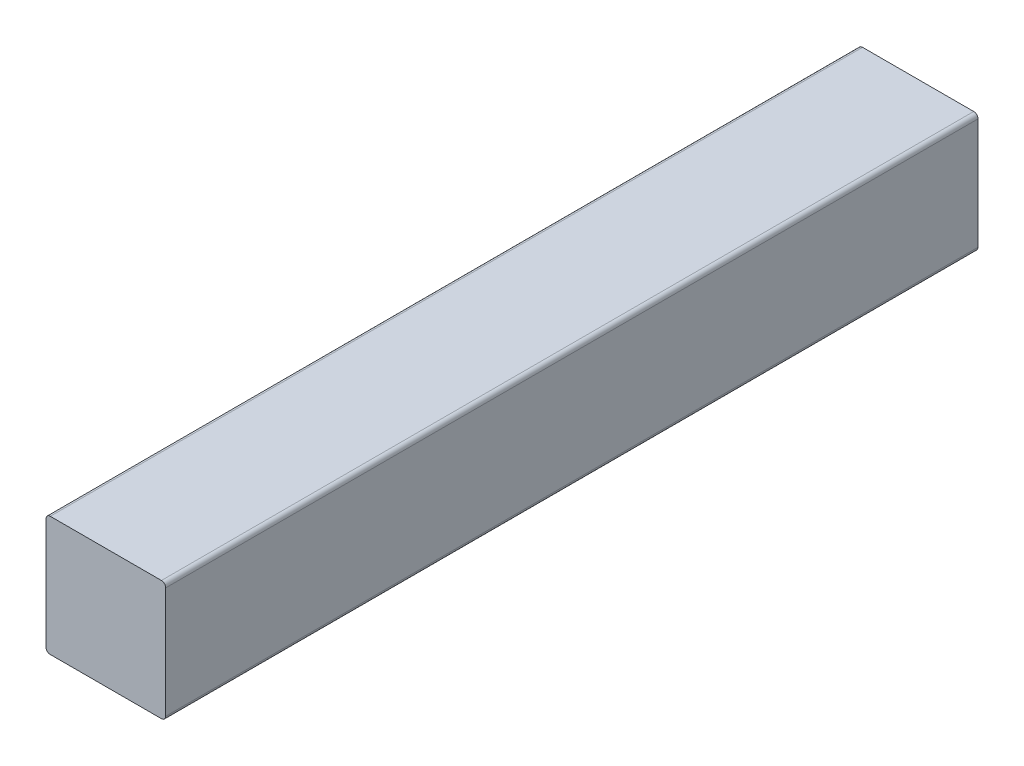
ISO-10303-21;
HEADER;
FILE_DESCRIPTION(('STEP AP214'),'2;1');
FILE_NAME('part.step','',(''),(''),'','','');
FILE_SCHEMA(('AUTOMOTIVE_DESIGN { 1 0 10303 214 1 1 1 1 }'));
ENDSEC;
DATA;
#1=APPLICATION_CONTEXT('core data for automotive mechanical design processes');
#2=APPLICATION_PROTOCOL_DEFINITION('international standard','automotive_design',2000,#1);
#3=PRODUCT_CONTEXT('',#1,'mechanical');
#4=PRODUCT('Part','Part','',(#3));
#5=PRODUCT_RELATED_PRODUCT_CATEGORY('part','',(#4));
#6=PRODUCT_DEFINITION_FORMATION('','',#4);
#7=PRODUCT_DEFINITION_CONTEXT('part definition',#1,'design');
#8=PRODUCT_DEFINITION('design','',#6,#7);
#9=PRODUCT_DEFINITION_SHAPE('','',#8);
#10=(LENGTH_UNIT() NAMED_UNIT(*) SI_UNIT(.MILLI.,.METRE.));
#11=(NAMED_UNIT(*) PLANE_ANGLE_UNIT() SI_UNIT($,.RADIAN.));
#12=(NAMED_UNIT(*) SI_UNIT($,.STERADIAN.) SOLID_ANGLE_UNIT());
#13=UNCERTAINTY_MEASURE_WITH_UNIT(LENGTH_MEASURE(1.E-05),#10,'distance_accuracy_value','');
#14=(GEOMETRIC_REPRESENTATION_CONTEXT(3) GLOBAL_UNCERTAINTY_ASSIGNED_CONTEXT((#13)) GLOBAL_UNIT_ASSIGNED_CONTEXT((#10,
#11,#12)) REPRESENTATION_CONTEXT('',''));
#15=CARTESIAN_POINT('',(0.,0.,0.));
#16=DIRECTION('',(0.,0.,1.));
#17=DIRECTION('',(1.,0.,0.));
#18=AXIS2_PLACEMENT_3D('',#15,#16,#17);
#19=CARTESIAN_POINT('',(44.45,88.9,-301.625));
#20=DIRECTION('',(-1.,0.,0.));
#21=DIRECTION('',(0.,0.,1.));
#22=AXIS2_PLACEMENT_3D('',#19,#20,#21);
#23=PLANE('',#22);
#24=DIRECTION('',(0.,-1.,0.));
#25=VECTOR('',#24,1.);
#26=CARTESIAN_POINT('',(44.45,88.9,301.625));
#27=LINE('',#26,#25);
#28=CARTESIAN_POINT('',(44.45,85.725,301.625));
#29=VERTEX_POINT('',#28);
#30=CARTESIAN_POINT('',(44.45,3.175,301.625));
#31=VERTEX_POINT('',#30);
#32=EDGE_CURVE('E121',#29,#31,#27,.T.);
#33=ORIENTED_EDGE('',*,*,#32,.T.);
#34=DIRECTION('',(0.,0.,-1.));
#35=VECTOR('',#34,1.);
#36=CARTESIAN_POINT('',(44.45,3.175,-301.625));
#37=LINE('',#36,#35);
#38=CARTESIAN_POINT('',(44.45,3.175,-301.625));
#39=VERTEX_POINT('',#38);
#40=EDGE_CURVE('E11',#31,#39,#37,.T.);
#41=ORIENTED_EDGE('',*,*,#40,.T.);
#42=DIRECTION('',(0.,-1.,0.));
#43=VECTOR('',#42,1.);
#44=CARTESIAN_POINT('',(44.45,88.9,-301.625));
#45=LINE('',#44,#43);
#46=CARTESIAN_POINT('',(44.45,85.725,-301.625));
#47=VERTEX_POINT('',#46);
#48=EDGE_CURVE('E126',#47,#39,#45,.T.);
#49=ORIENTED_EDGE('',*,*,#48,.F.);
#50=DIRECTION('',(0.,0.,-1.));
#51=VECTOR('',#50,1.);
#52=CARTESIAN_POINT('',(44.45,85.725,301.625));
#53=LINE('',#52,#51);
#54=EDGE_CURVE('E41',#47,#29,#53,.F.);
#55=ORIENTED_EDGE('',*,*,#54,.T.);
#56=EDGE_LOOP('',(#33,#41,#49,#55));
#57=FACE_BOUND('',#56,.T.);
#58=ADVANCED_FACE('F33',(#57),#23,.F.);
#59=CARTESIAN_POINT('',(-44.45,88.9,-301.625));
#60=DIRECTION('',(0.,0.,1.));
#61=DIRECTION('',(1.,0.,0.));
#62=AXIS2_PLACEMENT_3D('',#59,#60,#61);
#63=PLANE('',#62);
#64=DIRECTION('',(-1.,0.,0.));
#65=VECTOR('',#64,1.);
#66=CARTESIAN_POINT('',(-44.45,0.,-301.625));
#67=LINE('',#66,#65);
#68=CARTESIAN_POINT('',(41.275,0.,-301.625));
#69=VERTEX_POINT('',#68);
#70=CARTESIAN_POINT('',(-41.275,0.,-301.625));
#71=VERTEX_POINT('',#70);
#72=EDGE_CURVE('E168',#69,#71,#67,.T.);
#73=ORIENTED_EDGE('',*,*,#72,.T.);
#74=CARTESIAN_POINT('',(-41.275,3.175,-301.625));
#75=DIRECTION('',(0.,0.,1.));
#76=DIRECTION('',(1.,0.,0.));
#77=AXIS2_PLACEMENT_3D('',#74,#75,#76);
#78=CIRCLE('',#77,3.175);
#79=CARTESIAN_POINT('',(-44.45,3.175,-301.625));
#80=VERTEX_POINT('',#79);
#81=EDGE_CURVE('E143',#71,#80,#78,.F.);
#82=ORIENTED_EDGE('',*,*,#81,.T.);
#83=DIRECTION('',(0.,-1.,0.));
#84=VECTOR('',#83,1.);
#85=CARTESIAN_POINT('',(-44.45,88.9,-301.625));
#86=LINE('',#85,#84);
#87=CARTESIAN_POINT('',(-44.45,85.725,-301.625));
#88=VERTEX_POINT('',#87);
#89=EDGE_CURVE('E120',#88,#80,#86,.T.);
#90=ORIENTED_EDGE('',*,*,#89,.F.);
#91=CARTESIAN_POINT('',(-41.275,85.725,-301.625));
#92=DIRECTION('',(0.,0.,1.));
#93=DIRECTION('',(1.,0.,0.));
#94=AXIS2_PLACEMENT_3D('',#91,#92,#93);
#95=CIRCLE('',#94,3.175);
#96=CARTESIAN_POINT('',(-41.275,88.9,-301.625));
#97=VERTEX_POINT('',#96);
#98=EDGE_CURVE('E125',#88,#97,#95,.F.);
#99=ORIENTED_EDGE('',*,*,#98,.T.);
#100=DIRECTION('',(-1.,0.,0.));
#101=VECTOR('',#100,1.);
#102=CARTESIAN_POINT('',(-44.45,88.9,-301.625));
#103=LINE('',#102,#101);
#104=CARTESIAN_POINT('',(41.275,88.9,-301.625));
#105=VERTEX_POINT('',#104);
#106=EDGE_CURVE('E162',#105,#97,#103,.T.);
#107=ORIENTED_EDGE('',*,*,#106,.F.);
#108=CARTESIAN_POINT('',(41.275,85.725,-301.625));
#109=DIRECTION('',(0.,0.,1.));
#110=DIRECTION('',(1.,0.,0.));
#111=AXIS2_PLACEMENT_3D('',#108,#109,#110);
#112=CIRCLE('',#111,3.175);
#113=EDGE_CURVE('E55',#105,#47,#112,.F.);
#114=ORIENTED_EDGE('',*,*,#113,.T.);
#115=ORIENTED_EDGE('',*,*,#48,.T.);
#116=CARTESIAN_POINT('',(41.275,3.175,-301.625));
#117=DIRECTION('',(0.,0.,1.));
#118=DIRECTION('',(1.,0.,0.));
#119=AXIS2_PLACEMENT_3D('',#116,#117,#118);
#120=CIRCLE('',#119,3.175);
#121=EDGE_CURVE('E48',#39,#69,#120,.F.);
#122=ORIENTED_EDGE('',*,*,#121,.T.);
#123=EDGE_LOOP('',(#73,#82,#90,#99,#107,#114,#115,#122));
#124=FACE_BOUND('',#123,.T.);
#125=ADVANCED_FACE('F164',(#124),#63,.F.);
#126=CARTESIAN_POINT('',(-44.45,88.9,-301.625));
#127=DIRECTION('',(1.,0.,0.));
#128=DIRECTION('',(0.,0.,-1.));
#129=AXIS2_PLACEMENT_3D('',#126,#127,#128);
#130=PLANE('',#129);
#131=ORIENTED_EDGE('',*,*,#89,.T.);
#132=DIRECTION('',(0.,0.,1.));
#133=VECTOR('',#132,1.);
#134=CARTESIAN_POINT('',(-44.45,3.175,-301.625));
#135=LINE('',#134,#133);
#136=CARTESIAN_POINT('',(-44.45,3.175,301.625));
#137=VERTEX_POINT('',#136);
#138=EDGE_CURVE('E119',#80,#137,#135,.T.);
#139=ORIENTED_EDGE('',*,*,#138,.T.);
#140=DIRECTION('',(0.,-1.,0.));
#141=VECTOR('',#140,1.);
#142=CARTESIAN_POINT('',(-44.45,88.9,301.625));
#143=LINE('',#142,#141);
#144=CARTESIAN_POINT('',(-44.45,85.725,301.625));
#145=VERTEX_POINT('',#144);
#146=EDGE_CURVE('E102',#145,#137,#143,.T.);
#147=ORIENTED_EDGE('',*,*,#146,.F.);
#148=DIRECTION('',(0.,0.,1.));
#149=VECTOR('',#148,1.);
#150=CARTESIAN_POINT('',(-44.45,85.725,-301.625));
#151=LINE('',#150,#149);
#152=EDGE_CURVE('E116',#145,#88,#151,.F.);
#153=ORIENTED_EDGE('',*,*,#152,.T.);
#154=EDGE_LOOP('',(#131,#139,#147,#153));
#155=FACE_BOUND('',#154,.T.);
#156=ADVANCED_FACE('F115',(#155),#130,.F.);
#157=CARTESIAN_POINT('',(-44.45,88.9,301.625));
#158=DIRECTION('',(0.,0.,-1.));
#159=DIRECTION('',(-1.,0.,0.));
#160=AXIS2_PLACEMENT_3D('',#157,#158,#159);
#161=PLANE('',#160);
#162=ORIENTED_EDGE('',*,*,#146,.T.);
#163=CARTESIAN_POINT('',(-41.275,3.175,301.625));
#164=DIRECTION('',(0.,0.,-1.));
#165=DIRECTION('',(-1.,0.,0.));
#166=AXIS2_PLACEMENT_3D('',#163,#164,#165);
#167=CIRCLE('',#166,3.175);
#168=CARTESIAN_POINT('',(-41.275,0.,301.625));
#169=VERTEX_POINT('',#168);
#170=EDGE_CURVE('E109',#137,#169,#167,.F.);
#171=ORIENTED_EDGE('',*,*,#170,.T.);
#172=DIRECTION('',(1.,0.,0.));
#173=VECTOR('',#172,1.);
#174=CARTESIAN_POINT('',(-44.45,0.,301.625));
#175=LINE('',#174,#173);
#176=CARTESIAN_POINT('',(41.275,0.,301.625));
#177=VERTEX_POINT('',#176);
#178=EDGE_CURVE('E165',#169,#177,#175,.T.);
#179=ORIENTED_EDGE('',*,*,#178,.T.);
#180=CARTESIAN_POINT('',(41.275,3.175,301.625));
#181=DIRECTION('',(0.,0.,-1.));
#182=DIRECTION('',(-1.,0.,0.));
#183=AXIS2_PLACEMENT_3D('',#180,#181,#182);
#184=CIRCLE('',#183,3.175);
#185=EDGE_CURVE('E110',#177,#31,#184,.F.);
#186=ORIENTED_EDGE('',*,*,#185,.T.);
#187=ORIENTED_EDGE('',*,*,#32,.F.);
#188=CARTESIAN_POINT('',(41.275,85.725,301.625));
#189=DIRECTION('',(0.,0.,-1.));
#190=DIRECTION('',(-1.,0.,0.));
#191=AXIS2_PLACEMENT_3D('',#188,#189,#190);
#192=CIRCLE('',#191,3.175);
#193=CARTESIAN_POINT('',(41.275,88.9,301.625));
#194=VERTEX_POINT('',#193);
#195=EDGE_CURVE('E128',#29,#194,#192,.F.);
#196=ORIENTED_EDGE('',*,*,#195,.T.);
#197=DIRECTION('',(1.,0.,0.));
#198=VECTOR('',#197,1.);
#199=CARTESIAN_POINT('',(-44.45,88.9,301.625));
#200=LINE('',#199,#198);
#201=CARTESIAN_POINT('',(-41.275,88.9,301.625));
#202=VERTEX_POINT('',#201);
#203=EDGE_CURVE('E104',#202,#194,#200,.T.);
#204=ORIENTED_EDGE('',*,*,#203,.F.);
#205=CARTESIAN_POINT('',(-41.275,85.725,301.625));
#206=DIRECTION('',(0.,0.,-1.));
#207=DIRECTION('',(-1.,0.,0.));
#208=AXIS2_PLACEMENT_3D('',#205,#206,#207);
#209=CIRCLE('',#208,3.175);
#210=EDGE_CURVE('E99',#202,#145,#209,.F.);
#211=ORIENTED_EDGE('',*,*,#210,.T.);
#212=EDGE_LOOP('',(#162,#171,#179,#186,#187,#196,#204,#211));
#213=FACE_BOUND('',#212,.T.);
#214=ADVANCED_FACE('F101',(#213),#161,.F.);
#215=CARTESIAN_POINT('',(0.,88.9,0.));
#216=DIRECTION('',(0.,1.,0.));
#217=DIRECTION('',(0.,0.,1.));
#218=AXIS2_PLACEMENT_3D('',#215,#216,#217);
#219=PLANE('',#218);
#220=ORIENTED_EDGE('',*,*,#106,.T.);
#221=DIRECTION('',(0.,0.,1.));
#222=VECTOR('',#221,1.);
#223=CARTESIAN_POINT('',(-41.275,88.9,301.625));
#224=LINE('',#223,#222);
#225=EDGE_CURVE('E148',#97,#202,#224,.T.);
#226=ORIENTED_EDGE('',*,*,#225,.T.);
#227=ORIENTED_EDGE('',*,*,#203,.T.);
#228=DIRECTION('',(0.,0.,-1.));
#229=VECTOR('',#228,1.);
#230=CARTESIAN_POINT('',(41.275,88.9,-301.625));
#231=LINE('',#230,#229);
#232=EDGE_CURVE('E145',#194,#105,#231,.T.);
#233=ORIENTED_EDGE('',*,*,#232,.T.);
#234=EDGE_LOOP('',(#220,#226,#227,#233));
#235=FACE_BOUND('',#234,.T.);
#236=ADVANCED_FACE('F161',(#235),#219,.T.);
#237=CARTESIAN_POINT('',(0.,0.,0.));
#238=DIRECTION('',(0.,1.,0.));
#239=DIRECTION('',(0.,0.,1.));
#240=AXIS2_PLACEMENT_3D('',#237,#238,#239);
#241=PLANE('',#240);
#242=ORIENTED_EDGE('',*,*,#178,.F.);
#243=DIRECTION('',(0.,0.,1.));
#244=VECTOR('',#243,1.);
#245=CARTESIAN_POINT('',(-41.275,0.,0.));
#246=LINE('',#245,#244);
#247=EDGE_CURVE('E138',#169,#71,#246,.F.);
#248=ORIENTED_EDGE('',*,*,#247,.T.);
#249=ORIENTED_EDGE('',*,*,#72,.F.);
#250=DIRECTION('',(0.,0.,-1.));
#251=VECTOR('',#250,1.);
#252=CARTESIAN_POINT('',(41.275,0.,0.));
#253=LINE('',#252,#251);
#254=EDGE_CURVE('E136',#69,#177,#253,.F.);
#255=ORIENTED_EDGE('',*,*,#254,.T.);
#256=EDGE_LOOP('',(#242,#248,#249,#255));
#257=FACE_BOUND('',#256,.T.);
#258=ADVANCED_FACE('F177',(#257),#241,.F.);
#259=CARTESIAN_POINT('',(-41.275,3.175,-301.625));
#260=DIRECTION('',(0.,0.,1.));
#261=DIRECTION('',(1.,0.,0.));
#262=AXIS2_PLACEMENT_3D('',#259,#260,#261);
#263=CYLINDRICAL_SURFACE('',#262,3.175);
#264=ORIENTED_EDGE('',*,*,#81,.F.);
#265=ORIENTED_EDGE('',*,*,#247,.F.);
#266=ORIENTED_EDGE('',*,*,#170,.F.);
#267=ORIENTED_EDGE('',*,*,#138,.F.);
#268=EDGE_LOOP('',(#264,#265,#266,#267));
#269=FACE_BOUND('',#268,.T.);
#270=ADVANCED_FACE('F173',(#269),#263,.T.);
#271=CARTESIAN_POINT('',(-41.275,85.725,0.));
#272=DIRECTION('',(0.,0.,-1.));
#273=DIRECTION('',(-1.,0.,0.));
#274=AXIS2_PLACEMENT_3D('',#271,#272,#273);
#275=CYLINDRICAL_SURFACE('',#274,3.175);
#276=ORIENTED_EDGE('',*,*,#98,.F.);
#277=ORIENTED_EDGE('',*,*,#152,.F.);
#278=ORIENTED_EDGE('',*,*,#210,.F.);
#279=ORIENTED_EDGE('',*,*,#225,.F.);
#280=EDGE_LOOP('',(#276,#277,#278,#279));
#281=FACE_BOUND('',#280,.T.);
#282=ADVANCED_FACE('F124',(#281),#275,.T.);
#283=CARTESIAN_POINT('',(41.275,3.175,-301.625));
#284=DIRECTION('',(0.,0.,-1.));
#285=DIRECTION('',(-1.,0.,0.));
#286=AXIS2_PLACEMENT_3D('',#283,#284,#285);
#287=CYLINDRICAL_SURFACE('',#286,3.175);
#288=ORIENTED_EDGE('',*,*,#185,.F.);
#289=ORIENTED_EDGE('',*,*,#254,.F.);
#290=ORIENTED_EDGE('',*,*,#121,.F.);
#291=ORIENTED_EDGE('',*,*,#40,.F.);
#292=EDGE_LOOP('',(#288,#289,#290,#291));
#293=FACE_BOUND('',#292,.T.);
#294=ADVANCED_FACE('F179',(#293),#287,.T.);
#295=CARTESIAN_POINT('',(41.275,85.725,0.));
#296=DIRECTION('',(0.,0.,1.));
#297=DIRECTION('',(1.,0.,0.));
#298=AXIS2_PLACEMENT_3D('',#295,#296,#297);
#299=CYLINDRICAL_SURFACE('',#298,3.175);
#300=ORIENTED_EDGE('',*,*,#195,.F.);
#301=ORIENTED_EDGE('',*,*,#54,.F.);
#302=ORIENTED_EDGE('',*,*,#113,.F.);
#303=ORIENTED_EDGE('',*,*,#232,.F.);
#304=EDGE_LOOP('',(#300,#301,#302,#303));
#305=FACE_BOUND('',#304,.T.);
#306=ADVANCED_FACE('F35',(#305),#299,.T.);
#307=CLOSED_SHELL('',(#58,#125,#156,#214,#236,#258,#270,#282,#294,#306));
#308=MANIFOLD_SOLID_BREP('B2',#307);
#309=ADVANCED_BREP_SHAPE_REPRESENTATION('',(#18,#308),#14);
#310=SHAPE_DEFINITION_REPRESENTATION(#9,#309);
ENDSEC;
END-ISO-10303-21;
